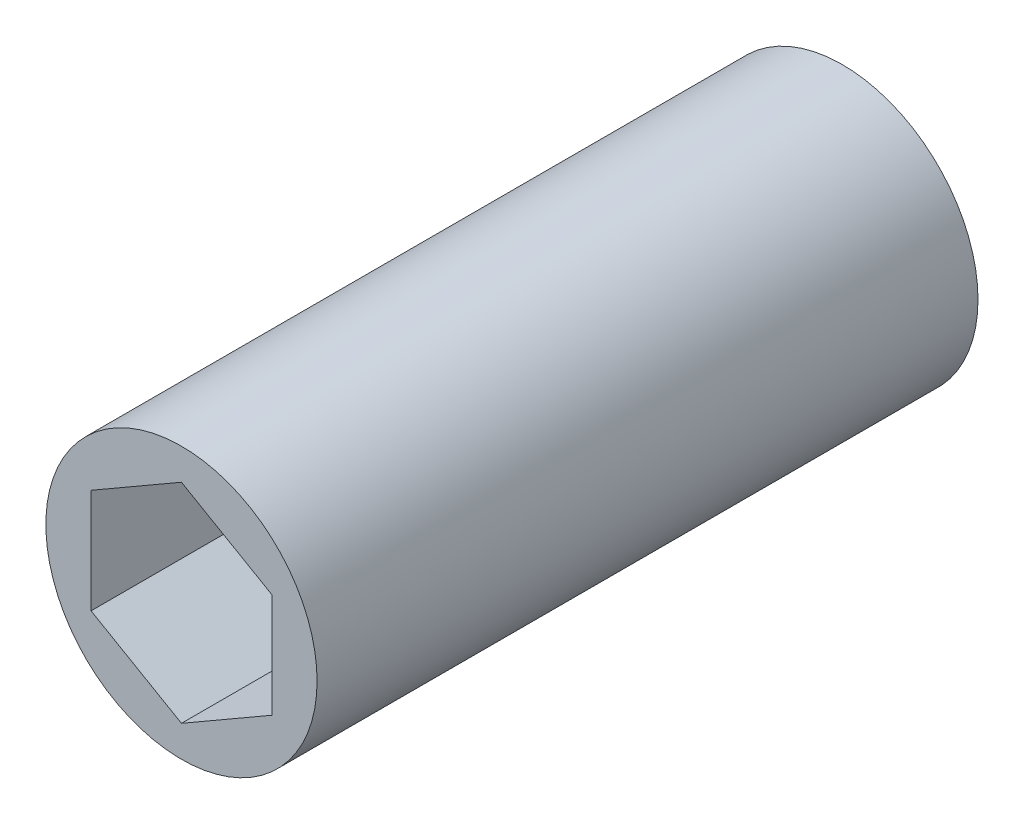
ISO-10303-21;
HEADER;
FILE_DESCRIPTION(('STEP AP214'),'2;1');
FILE_NAME('part.step','',(''),(''),'','','');
FILE_SCHEMA(('AUTOMOTIVE_DESIGN { 1 0 10303 214 1 1 1 1 }'));
ENDSEC;
DATA;
#1=APPLICATION_CONTEXT('core data for automotive mechanical design processes');
#2=APPLICATION_PROTOCOL_DEFINITION('international standard','automotive_design',2000,#1);
#3=PRODUCT_CONTEXT('',#1,'mechanical');
#4=PRODUCT('Part','Part','',(#3));
#5=PRODUCT_RELATED_PRODUCT_CATEGORY('part','',(#4));
#6=PRODUCT_DEFINITION_FORMATION('','',#4);
#7=PRODUCT_DEFINITION_CONTEXT('part definition',#1,'design');
#8=PRODUCT_DEFINITION('design','',#6,#7);
#9=PRODUCT_DEFINITION_SHAPE('','',#8);
#10=(LENGTH_UNIT() NAMED_UNIT(*) SI_UNIT(.MILLI.,.METRE.));
#11=(NAMED_UNIT(*) PLANE_ANGLE_UNIT() SI_UNIT($,.RADIAN.));
#12=(NAMED_UNIT(*) SI_UNIT($,.STERADIAN.) SOLID_ANGLE_UNIT());
#13=UNCERTAINTY_MEASURE_WITH_UNIT(LENGTH_MEASURE(1.E-05),#10,'distance_accuracy_value','');
#14=(GEOMETRIC_REPRESENTATION_CONTEXT(3) GLOBAL_UNCERTAINTY_ASSIGNED_CONTEXT((#13)) GLOBAL_UNIT_ASSIGNED_CONTEXT((#10,
#11,#12)) REPRESENTATION_CONTEXT('',''));
#15=CARTESIAN_POINT('',(0.,0.,0.));
#16=DIRECTION('',(0.,0.,1.));
#17=DIRECTION('',(1.,0.,0.));
#18=AXIS2_PLACEMENT_3D('',#15,#16,#17);
#19=CARTESIAN_POINT('',(0.,0.,23.20925));
#20=DIRECTION('',(0.,0.,1.));
#21=DIRECTION('',(1.,0.,0.));
#22=AXIS2_PLACEMENT_3D('',#19,#20,#21);
#23=PLANE('',#22);
#24=CARTESIAN_POINT('',(0.,0.,23.20925));
#25=DIRECTION('',(0.,0.,1.));
#26=DIRECTION('',(1.,0.,0.));
#27=AXIS2_PLACEMENT_3D('',#24,#25,#26);
#28=CIRCLE('',#27,9.525);
#29=CARTESIAN_POINT('',(9.525,0.,23.20925));
#30=VERTEX_POINT('',#29);
#31=EDGE_CURVE('E11',#30,#30,#28,.T.);
#32=ORIENTED_EDGE('',*,*,#31,.T.);
#33=EDGE_LOOP('',(#32));
#34=FACE_BOUND('',#33,.T.);
#35=DIRECTION('',(-0.866025403784438,-0.5,0.));
#36=VECTOR('',#35,1.);
#37=CARTESIAN_POINT('',(0.,7.33234841870825,23.20925));
#38=LINE('',#37,#36);
#39=CARTESIAN_POINT('',(0.,7.33234841870825,23.20925));
#40=VERTEX_POINT('',#39);
#41=CARTESIAN_POINT('',(-6.35,3.66617420935412,23.20925));
#42=VERTEX_POINT('',#41);
#43=EDGE_CURVE('E104',#40,#42,#38,.T.);
#44=ORIENTED_EDGE('',*,*,#43,.F.);
#45=DIRECTION('',(-0.866025403784439,0.5,0.));
#46=VECTOR('',#45,1.);
#47=CARTESIAN_POINT('',(6.35,3.66617420935413,23.20925));
#48=LINE('',#47,#46);
#49=CARTESIAN_POINT('',(6.35,3.66617420935413,23.20925));
#50=VERTEX_POINT('',#49);
#51=EDGE_CURVE('E96',#50,#40,#48,.T.);
#52=ORIENTED_EDGE('',*,*,#51,.F.);
#53=DIRECTION('',(0.,1.,0.));
#54=VECTOR('',#53,1.);
#55=CARTESIAN_POINT('',(6.35,-3.66617420935412,23.20925));
#56=LINE('',#55,#54);
#57=CARTESIAN_POINT('',(6.35,-3.66617420935412,23.20925));
#58=VERTEX_POINT('',#57);
#59=EDGE_CURVE('E124',#58,#50,#56,.T.);
#60=ORIENTED_EDGE('',*,*,#59,.F.);
#61=DIRECTION('',(0.866025403784438,0.5,0.));
#62=VECTOR('',#61,1.);
#63=CARTESIAN_POINT('',(0.,-7.33234841870825,23.20925));
#64=LINE('',#63,#62);
#65=CARTESIAN_POINT('',(0.,-7.33234841870825,23.20925));
#66=VERTEX_POINT('',#65);
#67=EDGE_CURVE('E122',#66,#58,#64,.T.);
#68=ORIENTED_EDGE('',*,*,#67,.F.);
#69=DIRECTION('',(0.866025403784439,-0.5,0.));
#70=VECTOR('',#69,1.);
#71=CARTESIAN_POINT('',(-6.35,-3.66617420935412,23.20925));
#72=LINE('',#71,#70);
#73=CARTESIAN_POINT('',(-6.35,-3.66617420935412,23.20925));
#74=VERTEX_POINT('',#73);
#75=EDGE_CURVE('E118',#74,#66,#72,.T.);
#76=ORIENTED_EDGE('',*,*,#75,.F.);
#77=DIRECTION('',(0.,-1.,0.));
#78=VECTOR('',#77,1.);
#79=CARTESIAN_POINT('',(-6.35,3.66617420935412,23.20925));
#80=LINE('',#79,#78);
#81=EDGE_CURVE('E116',#42,#74,#80,.T.);
#82=ORIENTED_EDGE('',*,*,#81,.F.);
#83=EDGE_LOOP('',(#44,#52,#60,#68,#76,#82));
#84=FACE_BOUND('',#83,.T.);
#85=ADVANCED_FACE('F43',(#34,#84),#23,.T.);
#86=CARTESIAN_POINT('',(0.,0.,-23.20925));
#87=DIRECTION('',(0.,0.,1.));
#88=DIRECTION('',(1.,0.,0.));
#89=AXIS2_PLACEMENT_3D('',#86,#87,#88);
#90=PLANE('',#89);
#91=CARTESIAN_POINT('',(0.,0.,-23.20925));
#92=DIRECTION('',(0.,0.,1.));
#93=DIRECTION('',(1.,0.,0.));
#94=AXIS2_PLACEMENT_3D('',#91,#92,#93);
#95=CIRCLE('',#94,9.525);
#96=CARTESIAN_POINT('',(9.525,0.,-23.20925));
#97=VERTEX_POINT('',#96);
#98=EDGE_CURVE('E47',#97,#97,#95,.T.);
#99=ORIENTED_EDGE('',*,*,#98,.F.);
#100=EDGE_LOOP('',(#99));
#101=FACE_BOUND('',#100,.T.);
#102=DIRECTION('',(-0.866025403784439,0.5,0.));
#103=VECTOR('',#102,1.);
#104=CARTESIAN_POINT('',(6.35,3.66617420935413,-23.20925));
#105=LINE('',#104,#103);
#106=CARTESIAN_POINT('',(6.35,3.66617420935413,-23.20925));
#107=VERTEX_POINT('',#106);
#108=CARTESIAN_POINT('',(0.,7.33234841870825,-23.20925));
#109=VERTEX_POINT('',#108);
#110=EDGE_CURVE('E66',#107,#109,#105,.T.);
#111=ORIENTED_EDGE('',*,*,#110,.T.);
#112=DIRECTION('',(-0.866025403784438,-0.5,0.));
#113=VECTOR('',#112,1.);
#114=CARTESIAN_POINT('',(0.,7.33234841870825,-23.20925));
#115=LINE('',#114,#113);
#116=CARTESIAN_POINT('',(-6.35,3.66617420935412,-23.20925));
#117=VERTEX_POINT('',#116);
#118=EDGE_CURVE('E111',#109,#117,#115,.T.);
#119=ORIENTED_EDGE('',*,*,#118,.T.);
#120=DIRECTION('',(0.,-1.,0.));
#121=VECTOR('',#120,1.);
#122=CARTESIAN_POINT('',(-6.35,3.66617420935412,-23.20925));
#123=LINE('',#122,#121);
#124=CARTESIAN_POINT('',(-6.35,-3.66617420935412,-23.20925));
#125=VERTEX_POINT('',#124);
#126=EDGE_CURVE('E128',#117,#125,#123,.T.);
#127=ORIENTED_EDGE('',*,*,#126,.T.);
#128=DIRECTION('',(0.866025403784439,-0.5,0.));
#129=VECTOR('',#128,1.);
#130=CARTESIAN_POINT('',(-6.35,-3.66617420935412,-23.20925));
#131=LINE('',#130,#129);
#132=CARTESIAN_POINT('',(0.,-7.33234841870825,-23.20925));
#133=VERTEX_POINT('',#132);
#134=EDGE_CURVE('E131',#125,#133,#131,.T.);
#135=ORIENTED_EDGE('',*,*,#134,.T.);
#136=DIRECTION('',(0.866025403784438,0.5,0.));
#137=VECTOR('',#136,1.);
#138=CARTESIAN_POINT('',(0.,-7.33234841870825,-23.20925));
#139=LINE('',#138,#137);
#140=CARTESIAN_POINT('',(6.35,-3.66617420935412,-23.20925));
#141=VERTEX_POINT('',#140);
#142=EDGE_CURVE('E134',#133,#141,#139,.T.);
#143=ORIENTED_EDGE('',*,*,#142,.T.);
#144=DIRECTION('',(0.,1.,0.));
#145=VECTOR('',#144,1.);
#146=CARTESIAN_POINT('',(6.35,-3.66617420935412,-23.20925));
#147=LINE('',#146,#145);
#148=EDGE_CURVE('E105',#141,#107,#147,.T.);
#149=ORIENTED_EDGE('',*,*,#148,.T.);
#150=EDGE_LOOP('',(#111,#119,#127,#135,#143,#149));
#151=FACE_BOUND('',#150,.T.);
#152=ADVANCED_FACE('F151',(#101,#151),#90,.F.);
#153=CARTESIAN_POINT('',(0.,0.,23.20925));
#154=DIRECTION('',(0.,0.,-1.));
#155=DIRECTION('',(-1.,0.,0.));
#156=AXIS2_PLACEMENT_3D('',#153,#154,#155);
#157=CYLINDRICAL_SURFACE('',#156,9.525);
#158=ORIENTED_EDGE('',*,*,#31,.F.);
#159=EDGE_LOOP('',(#158));
#160=FACE_BOUND('',#159,.T.);
#161=ORIENTED_EDGE('',*,*,#98,.T.);
#162=EDGE_LOOP('',(#161));
#163=FACE_BOUND('',#162,.T.);
#164=ADVANCED_FACE('F45',(#160,#163),#157,.T.);
#165=CARTESIAN_POINT('',(6.35,3.66617420935413,23.20925));
#166=DIRECTION('',(-0.5,-0.866025403784439,0.));
#167=DIRECTION('',(0.866025403784439,-0.5,0.));
#168=AXIS2_PLACEMENT_3D('',#165,#166,#167);
#169=PLANE('',#168);
#170=ORIENTED_EDGE('',*,*,#110,.F.);
#171=DIRECTION('',(0.,0.,-1.));
#172=VECTOR('',#171,1.);
#173=CARTESIAN_POINT('',(6.35,3.66617420935413,23.20925));
#174=LINE('',#173,#172);
#175=EDGE_CURVE('E100',#50,#107,#174,.T.);
#176=ORIENTED_EDGE('',*,*,#175,.F.);
#177=ORIENTED_EDGE('',*,*,#51,.T.);
#178=DIRECTION('',(0.,0.,-1.));
#179=VECTOR('',#178,1.);
#180=CARTESIAN_POINT('',(0.,7.33234841870825,23.20925));
#181=LINE('',#180,#179);
#182=EDGE_CURVE('E99',#40,#109,#181,.T.);
#183=ORIENTED_EDGE('',*,*,#182,.T.);
#184=EDGE_LOOP('',(#170,#176,#177,#183));
#185=FACE_BOUND('',#184,.T.);
#186=ADVANCED_FACE('F98',(#185),#169,.T.);
#187=CARTESIAN_POINT('',(0.,7.33234841870825,23.20925));
#188=DIRECTION('',(0.5,-0.866025403784439,0.));
#189=DIRECTION('',(0.866025403784439,0.5,0.));
#190=AXIS2_PLACEMENT_3D('',#187,#188,#189);
#191=PLANE('',#190);
#192=ORIENTED_EDGE('',*,*,#118,.F.);
#193=ORIENTED_EDGE('',*,*,#182,.F.);
#194=ORIENTED_EDGE('',*,*,#43,.T.);
#195=DIRECTION('',(0.,0.,-1.));
#196=VECTOR('',#195,1.);
#197=CARTESIAN_POINT('',(-6.35,3.66617420935412,23.20925));
#198=LINE('',#197,#196);
#199=EDGE_CURVE('E112',#42,#117,#198,.T.);
#200=ORIENTED_EDGE('',*,*,#199,.T.);
#201=EDGE_LOOP('',(#192,#193,#194,#200));
#202=FACE_BOUND('',#201,.T.);
#203=ADVANCED_FACE('F108',(#202),#191,.T.);
#204=CARTESIAN_POINT('',(-6.35,3.66617420935412,23.20925));
#205=DIRECTION('',(1.,0.,0.));
#206=DIRECTION('',(0.,1.,0.));
#207=AXIS2_PLACEMENT_3D('',#204,#205,#206);
#208=PLANE('',#207);
#209=ORIENTED_EDGE('',*,*,#126,.F.);
#210=ORIENTED_EDGE('',*,*,#199,.F.);
#211=ORIENTED_EDGE('',*,*,#81,.T.);
#212=DIRECTION('',(0.,0.,-1.));
#213=VECTOR('',#212,1.);
#214=CARTESIAN_POINT('',(-6.35,-3.66617420935412,23.20925));
#215=LINE('',#214,#213);
#216=EDGE_CURVE('E143',#74,#125,#215,.T.);
#217=ORIENTED_EDGE('',*,*,#216,.T.);
#218=EDGE_LOOP('',(#209,#210,#211,#217));
#219=FACE_BOUND('',#218,.T.);
#220=ADVANCED_FACE('F147',(#219),#208,.T.);
#221=CARTESIAN_POINT('',(-6.35,-3.66617420935412,23.20925));
#222=DIRECTION('',(0.5,0.866025403784439,0.));
#223=DIRECTION('',(-0.866025403784439,0.5,0.));
#224=AXIS2_PLACEMENT_3D('',#221,#222,#223);
#225=PLANE('',#224);
#226=ORIENTED_EDGE('',*,*,#134,.F.);
#227=ORIENTED_EDGE('',*,*,#216,.F.);
#228=ORIENTED_EDGE('',*,*,#75,.T.);
#229=DIRECTION('',(0.,0.,-1.));
#230=VECTOR('',#229,1.);
#231=CARTESIAN_POINT('',(0.,-7.33234841870825,23.20925));
#232=LINE('',#231,#230);
#233=EDGE_CURVE('E141',#66,#133,#232,.T.);
#234=ORIENTED_EDGE('',*,*,#233,.T.);
#235=EDGE_LOOP('',(#226,#227,#228,#234));
#236=FACE_BOUND('',#235,.T.);
#237=ADVANCED_FACE('F159',(#236),#225,.T.);
#238=CARTESIAN_POINT('',(0.,-7.33234841870825,23.20925));
#239=DIRECTION('',(-0.5,0.866025403784439,0.));
#240=DIRECTION('',(-0.866025403784439,-0.5,0.));
#241=AXIS2_PLACEMENT_3D('',#238,#239,#240);
#242=PLANE('',#241);
#243=ORIENTED_EDGE('',*,*,#142,.F.);
#244=ORIENTED_EDGE('',*,*,#233,.F.);
#245=ORIENTED_EDGE('',*,*,#67,.T.);
#246=DIRECTION('',(0.,0.,-1.));
#247=VECTOR('',#246,1.);
#248=CARTESIAN_POINT('',(6.35,-3.66617420935412,23.20925));
#249=LINE('',#248,#247);
#250=EDGE_CURVE('E58',#58,#141,#249,.T.);
#251=ORIENTED_EDGE('',*,*,#250,.T.);
#252=EDGE_LOOP('',(#243,#244,#245,#251));
#253=FACE_BOUND('',#252,.T.);
#254=ADVANCED_FACE('F157',(#253),#242,.T.);
#255=CARTESIAN_POINT('',(6.35,-3.66617420935412,23.20925));
#256=DIRECTION('',(-1.,0.,0.));
#257=DIRECTION('',(0.,-1.,0.));
#258=AXIS2_PLACEMENT_3D('',#255,#256,#257);
#259=PLANE('',#258);
#260=ORIENTED_EDGE('',*,*,#148,.F.);
#261=ORIENTED_EDGE('',*,*,#250,.F.);
#262=ORIENTED_EDGE('',*,*,#59,.T.);
#263=ORIENTED_EDGE('',*,*,#175,.T.);
#264=EDGE_LOOP('',(#260,#261,#262,#263));
#265=FACE_BOUND('',#264,.T.);
#266=ADVANCED_FACE('F153',(#265),#259,.T.);
#267=CLOSED_SHELL('',(#85,#152,#164,#186,#203,#220,#237,#254,#266));
#268=MANIFOLD_SOLID_BREP('B2',#267);
#269=ADVANCED_BREP_SHAPE_REPRESENTATION('',(#18,#268),#14);
#270=SHAPE_DEFINITION_REPRESENTATION(#9,#269);
ENDSEC;
END-ISO-10303-21;
